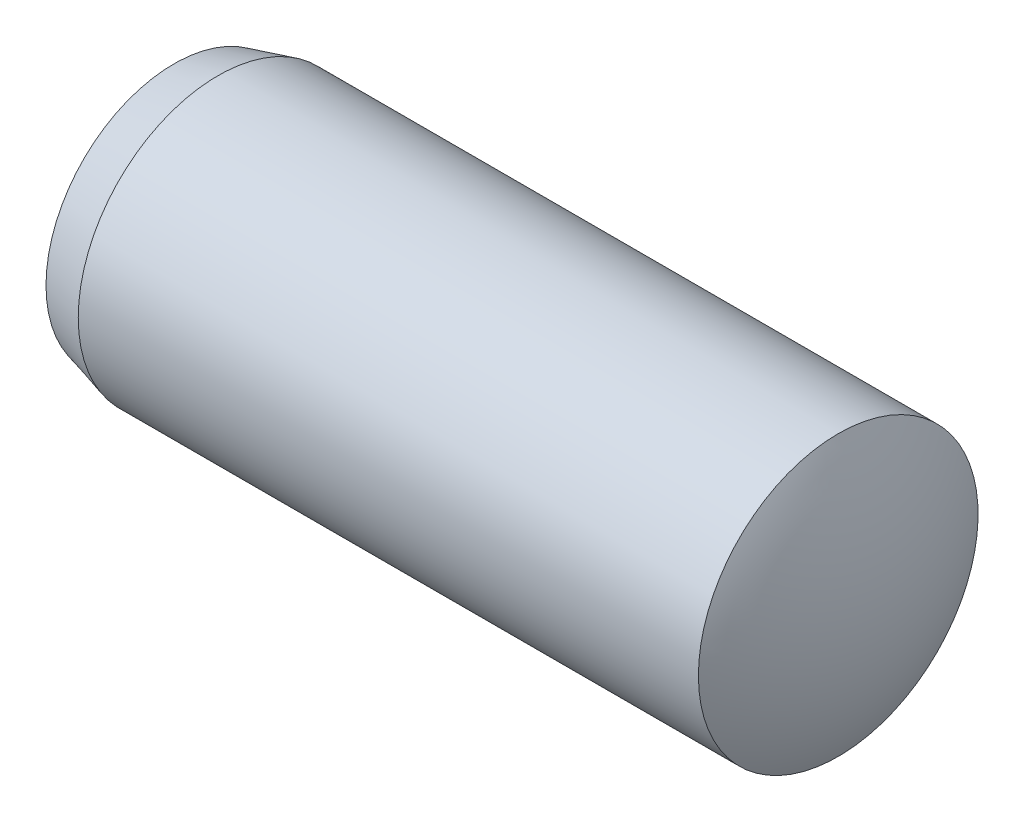
ISO-10303-21;
HEADER;
FILE_DESCRIPTION(('STEP AP214'),'2;1');
FILE_NAME('part.step','',(''),(''),'','','');
FILE_SCHEMA(('AUTOMOTIVE_DESIGN { 1 0 10303 214 1 1 1 1 }'));
ENDSEC;
DATA;
#1=APPLICATION_CONTEXT('core data for automotive mechanical design processes');
#2=APPLICATION_PROTOCOL_DEFINITION('international standard','automotive_design',2000,#1);
#3=PRODUCT_CONTEXT('',#1,'mechanical');
#4=PRODUCT('Part','Part','',(#3));
#5=PRODUCT_RELATED_PRODUCT_CATEGORY('part','',(#4));
#6=PRODUCT_DEFINITION_FORMATION('','',#4);
#7=PRODUCT_DEFINITION_CONTEXT('part definition',#1,'design');
#8=PRODUCT_DEFINITION('design','',#6,#7);
#9=PRODUCT_DEFINITION_SHAPE('','',#8);
#10=(LENGTH_UNIT() NAMED_UNIT(*) SI_UNIT(.MILLI.,.METRE.));
#11=(NAMED_UNIT(*) PLANE_ANGLE_UNIT() SI_UNIT($,.RADIAN.));
#12=(NAMED_UNIT(*) SI_UNIT($,.STERADIAN.) SOLID_ANGLE_UNIT());
#13=UNCERTAINTY_MEASURE_WITH_UNIT(LENGTH_MEASURE(1.E-05),#10,'distance_accuracy_value','');
#14=(GEOMETRIC_REPRESENTATION_CONTEXT(3) GLOBAL_UNCERTAINTY_ASSIGNED_CONTEXT((#13)) GLOBAL_UNIT_ASSIGNED_CONTEXT((#10,
#11,#12)) REPRESENTATION_CONTEXT('',''));
#15=CARTESIAN_POINT('',(0.,0.,0.));
#16=DIRECTION('',(0.,0.,1.));
#17=DIRECTION('',(1.,0.,0.));
#18=AXIS2_PLACEMENT_3D('',#15,#16,#17);
#19=CARTESIAN_POINT('',(-4.25000000000001,0.,0.));
#20=DIRECTION('',(-1.,0.,0.));
#21=DIRECTION('',(0.,1.,0.));
#22=AXIS2_PLACEMENT_3D('',#19,#20,#21);
#23=SPHERICAL_SURFACE('',#22,4.25000000000001);
#24=CARTESIAN_POINT('',(-0.5,0.,0.));
#25=DIRECTION('',(-1.,0.,0.));
#26=DIRECTION('',(0.,0.,1.));
#27=AXIS2_PLACEMENT_3D('',#24,#25,#26);
#28=CIRCLE('',#27,2.);
#29=CARTESIAN_POINT('',(-0.5,0.,2.));
#30=VERTEX_POINT('',#29);
#31=EDGE_CURVE('E10',#30,#30,#28,.T.);
#32=ORIENTED_EDGE('',*,*,#31,.F.);
#33=EDGE_LOOP('',(#32));
#34=FACE_BOUND('',#33,.T.);
#35=ADVANCED_FACE('F32',(#34),#23,.T.);
#36=CARTESIAN_POINT('',(-11.0225172437595,0.,0.));
#37=DIRECTION('',(-1.,0.,0.));
#38=DIRECTION('',(0.,0.,1.));
#39=AXIS2_PLACEMENT_3D('',#36,#37,#38);
#40=CYLINDRICAL_SURFACE('',#39,2.);
#41=CARTESIAN_POINT('',(-9.37,0.,0.));
#42=DIRECTION('',(-1.,0.,0.));
#43=DIRECTION('',(0.,0.,1.));
#44=AXIS2_PLACEMENT_3D('',#41,#42,#43);
#45=CIRCLE('',#44,2.);
#46=CARTESIAN_POINT('',(-9.37,0.,2.));
#47=VERTEX_POINT('',#46);
#48=EDGE_CURVE('E38',#47,#47,#45,.T.);
#49=ORIENTED_EDGE('',*,*,#48,.F.);
#50=EDGE_LOOP('',(#49));
#51=FACE_BOUND('',#50,.T.);
#52=ORIENTED_EDGE('',*,*,#31,.T.);
#53=EDGE_LOOP('',(#52));
#54=FACE_BOUND('',#53,.T.);
#55=ADVANCED_FACE('F53',(#51,#54),#40,.T.);
#56=CARTESIAN_POINT('',(-9.37,0.,0.));
#57=DIRECTION('',(1.,0.,0.));
#58=DIRECTION('',(0.,0.,-1.));
#59=AXIS2_PLACEMENT_3D('',#56,#57,#58);
#60=CONICAL_SURFACE('',#59,2.,0.261799387799145);
#61=CARTESIAN_POINT('',(-10.,0.,0.));
#62=DIRECTION('',(-1.,0.,0.));
#63=DIRECTION('',(0.,0.,1.));
#64=AXIS2_PLACEMENT_3D('',#61,#62,#63);
#65=CIRCLE('',#64,1.8311920087684);
#66=CARTESIAN_POINT('',(-10.,0.,1.8311920087684));
#67=VERTEX_POINT('',#66);
#68=EDGE_CURVE('E42',#67,#67,#65,.T.);
#69=ORIENTED_EDGE('',*,*,#68,.F.);
#70=EDGE_LOOP('',(#69));
#71=FACE_BOUND('',#70,.T.);
#72=ORIENTED_EDGE('',*,*,#48,.T.);
#73=EDGE_LOOP('',(#72));
#74=FACE_BOUND('',#73,.T.);
#75=ADVANCED_FACE('F51',(#71,#74),#60,.T.);
#76=CARTESIAN_POINT('',(-10.,1.8311920087684,0.));
#77=DIRECTION('',(1.,0.,0.));
#78=DIRECTION('',(0.,0.,-1.));
#79=AXIS2_PLACEMENT_3D('',#76,#77,#78);
#80=PLANE('',#79);
#81=ORIENTED_EDGE('',*,*,#68,.T.);
#82=EDGE_LOOP('',(#81));
#83=FACE_BOUND('',#82,.T.);
#84=ADVANCED_FACE('F49',(#83),#80,.F.);
#85=CLOSED_SHELL('',(#35,#55,#75,#84));
#86=MANIFOLD_SOLID_BREP('B2',#85);
#87=ADVANCED_BREP_SHAPE_REPRESENTATION('',(#18,#86),#14);
#88=SHAPE_DEFINITION_REPRESENTATION(#9,#87);
ENDSEC;
END-ISO-10303-21;
